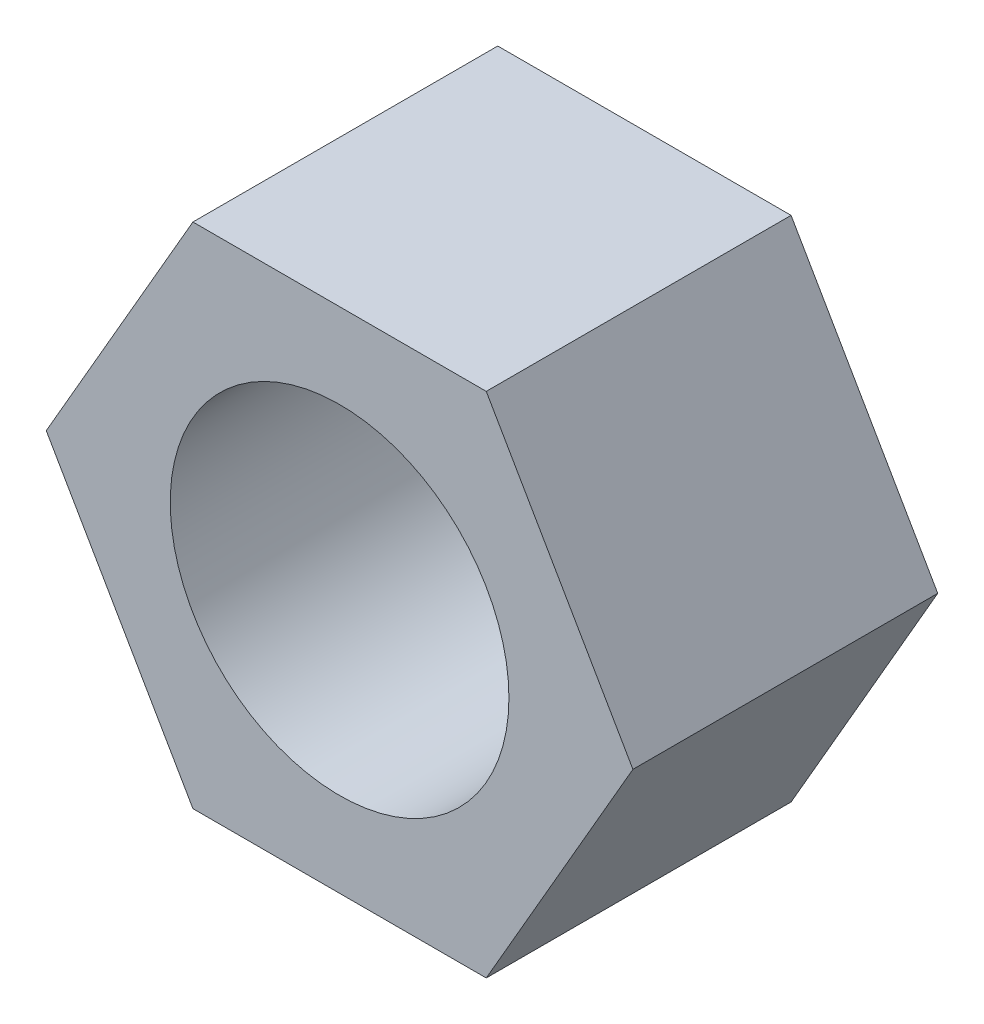
ISO-10303-21;
HEADER;
FILE_DESCRIPTION(('STEP AP214'),'2;1');
FILE_NAME('part.step','',(''),(''),'','','');
FILE_SCHEMA(('AUTOMOTIVE_DESIGN { 1 0 10303 214 1 1 1 1 }'));
ENDSEC;
DATA;
#1=APPLICATION_CONTEXT('core data for automotive mechanical design processes');
#2=APPLICATION_PROTOCOL_DEFINITION('international standard','automotive_design',2000,#1);
#3=PRODUCT_CONTEXT('',#1,'mechanical');
#4=PRODUCT('Part','Part','',(#3));
#5=PRODUCT_RELATED_PRODUCT_CATEGORY('part','',(#4));
#6=PRODUCT_DEFINITION_FORMATION('','',#4);
#7=PRODUCT_DEFINITION_CONTEXT('part definition',#1,'design');
#8=PRODUCT_DEFINITION('design','',#6,#7);
#9=PRODUCT_DEFINITION_SHAPE('','',#8);
#10=(LENGTH_UNIT() NAMED_UNIT(*) SI_UNIT(.MILLI.,.METRE.));
#11=(NAMED_UNIT(*) PLANE_ANGLE_UNIT() SI_UNIT($,.RADIAN.));
#12=(NAMED_UNIT(*) SI_UNIT($,.STERADIAN.) SOLID_ANGLE_UNIT());
#13=UNCERTAINTY_MEASURE_WITH_UNIT(LENGTH_MEASURE(1.E-05),#10,'distance_accuracy_value','');
#14=(GEOMETRIC_REPRESENTATION_CONTEXT(3) GLOBAL_UNCERTAINTY_ASSIGNED_CONTEXT((#13)) GLOBAL_UNIT_ASSIGNED_CONTEXT((#10,
#11,#12)) REPRESENTATION_CONTEXT('',''));
#15=CARTESIAN_POINT('',(0.,0.,0.));
#16=DIRECTION('',(0.,0.,1.));
#17=DIRECTION('',(1.,0.,0.));
#18=AXIS2_PLACEMENT_3D('',#15,#16,#17);
#19=CARTESIAN_POINT('',(-100.,100.,12.5));
#20=DIRECTION('',(0.,0.,-1.));
#21=DIRECTION('',(1.,0.,0.));
#22=AXIS2_PLACEMENT_3D('',#19,#20,#21);
#23=CYLINDRICAL_SURFACE('',#22,6.);
#24=DIRECTION('',(0.,0.,1.));
#25=VECTOR('',#24,1.);
#26=CARTESIAN_POINT('',(-94.,100.,12.5));
#27=LINE('',#26,#25);
#28=CARTESIAN_POINT('',(-94.,100.,12.5));
#29=VERTEX_POINT('',#28);
#30=CARTESIAN_POINT('',(-94.,100.,23.3));
#31=VERTEX_POINT('',#30);
#32=EDGE_CURVE('E11',#29,#31,#27,.T.);
#33=ORIENTED_EDGE('',*,*,#32,.T.);
#34=CARTESIAN_POINT('',(-100.,100.,23.3));
#35=DIRECTION('',(0.,0.,1.));
#36=DIRECTION('',(1.,0.,0.));
#37=AXIS2_PLACEMENT_3D('',#34,#35,#36);
#38=CIRCLE('',#37,6.);
#39=EDGE_CURVE('E127',#31,#31,#38,.T.);
#40=ORIENTED_EDGE('',*,*,#39,.T.);
#41=ORIENTED_EDGE('',*,*,#32,.F.);
#42=CARTESIAN_POINT('',(-100.,100.,12.5));
#43=DIRECTION('',(0.,0.,1.));
#44=DIRECTION('',(1.,0.,0.));
#45=AXIS2_PLACEMENT_3D('',#42,#43,#44);
#46=CIRCLE('',#45,6.);
#47=EDGE_CURVE('E116',#29,#29,#46,.T.);
#48=ORIENTED_EDGE('',*,*,#47,.F.);
#49=EDGE_LOOP('',(#33,#40,#41,#48));
#50=FACE_BOUND('',#49,.T.);
#51=ADVANCED_FACE('F17',(#50),#23,.F.);
#52=CARTESIAN_POINT('',(-110.3923048454,100.,12.5));
#53=DIRECTION('',(0.866025403784329,0.50000000000019,0.));
#54=DIRECTION('',(0.,0.,-1.));
#55=AXIS2_PLACEMENT_3D('',#52,#53,#54);
#56=PLANE('',#55);
#57=DIRECTION('',(0.50000000000019,-0.866025403784329,0.));
#58=VECTOR('',#57,1.);
#59=CARTESIAN_POINT('',(-110.3923048454,100.,12.5));
#60=LINE('',#59,#58);
#61=CARTESIAN_POINT('',(-110.3923048454,100.,12.5));
#62=VERTEX_POINT('',#61);
#63=CARTESIAN_POINT('',(-105.1961524227,91.,12.5));
#64=VERTEX_POINT('',#63);
#65=EDGE_CURVE('E149',#62,#64,#60,.T.);
#66=ORIENTED_EDGE('',*,*,#65,.T.);
#67=DIRECTION('',(0.,0.,1.));
#68=VECTOR('',#67,1.);
#69=CARTESIAN_POINT('',(-105.1961524227,91.,12.5));
#70=LINE('',#69,#68);
#71=CARTESIAN_POINT('',(-105.1961524227,91.,23.3));
#72=VERTEX_POINT('',#71);
#73=EDGE_CURVE('E101',#64,#72,#70,.T.);
#74=ORIENTED_EDGE('',*,*,#73,.T.);
#75=DIRECTION('',(0.50000000000019,-0.866025403784329,0.));
#76=VECTOR('',#75,1.);
#77=CARTESIAN_POINT('',(-110.3923048454,100.,23.3));
#78=LINE('',#77,#76);
#79=CARTESIAN_POINT('',(-110.3923048454,100.,23.3));
#80=VERTEX_POINT('',#79);
#81=EDGE_CURVE('E104',#80,#72,#78,.T.);
#82=ORIENTED_EDGE('',*,*,#81,.F.);
#83=DIRECTION('',(0.,0.,1.));
#84=VECTOR('',#83,1.);
#85=CARTESIAN_POINT('',(-110.3923048454,100.,12.5));
#86=LINE('',#85,#84);
#87=EDGE_CURVE('E27',#62,#80,#86,.T.);
#88=ORIENTED_EDGE('',*,*,#87,.F.);
#89=EDGE_LOOP('',(#66,#74,#82,#88));
#90=FACE_BOUND('',#89,.T.);
#91=ADVANCED_FACE('F105',(#90),#56,.F.);
#92=CARTESIAN_POINT('',(-105.1961524227,109.,12.5));
#93=DIRECTION('',(0.866025403784329,-0.50000000000019,0.));
#94=DIRECTION('',(0.,0.,-1.));
#95=AXIS2_PLACEMENT_3D('',#92,#93,#94);
#96=PLANE('',#95);
#97=DIRECTION('',(-0.50000000000019,-0.866025403784329,0.));
#98=VECTOR('',#97,1.);
#99=CARTESIAN_POINT('',(-105.1961524227,109.,12.5));
#100=LINE('',#99,#98);
#101=CARTESIAN_POINT('',(-105.1961524227,109.,12.5));
#102=VERTEX_POINT('',#101);
#103=EDGE_CURVE('E96',#102,#62,#100,.T.);
#104=ORIENTED_EDGE('',*,*,#103,.T.);
#105=ORIENTED_EDGE('',*,*,#87,.T.);
#106=DIRECTION('',(-0.50000000000019,-0.866025403784329,0.));
#107=VECTOR('',#106,1.);
#108=CARTESIAN_POINT('',(-105.1961524227,109.,23.3));
#109=LINE('',#108,#107);
#110=CARTESIAN_POINT('',(-105.1961524227,109.,23.3));
#111=VERTEX_POINT('',#110);
#112=EDGE_CURVE('E94',#111,#80,#109,.T.);
#113=ORIENTED_EDGE('',*,*,#112,.F.);
#114=DIRECTION('',(0.,0.,1.));
#115=VECTOR('',#114,1.);
#116=CARTESIAN_POINT('',(-105.1961524227,109.,12.5));
#117=LINE('',#116,#115);
#118=EDGE_CURVE('E166',#102,#111,#117,.T.);
#119=ORIENTED_EDGE('',*,*,#118,.F.);
#120=EDGE_LOOP('',(#104,#105,#113,#119));
#121=FACE_BOUND('',#120,.T.);
#122=ADVANCED_FACE('F19',(#121),#96,.F.);
#123=CARTESIAN_POINT('',(-105.1961524227,91.,12.5));
#124=DIRECTION('',(0.,1.,0.));
#125=DIRECTION('',(1.,0.,0.));
#126=AXIS2_PLACEMENT_3D('',#123,#124,#125);
#127=PLANE('',#126);
#128=DIRECTION('',(1.,0.,0.));
#129=VECTOR('',#128,1.);
#130=CARTESIAN_POINT('',(-105.1961524227,91.,12.5));
#131=LINE('',#130,#129);
#132=CARTESIAN_POINT('',(-94.80384757729,91.,12.5));
#133=VERTEX_POINT('',#132);
#134=EDGE_CURVE('E154',#64,#133,#131,.T.);
#135=ORIENTED_EDGE('',*,*,#134,.T.);
#136=DIRECTION('',(0.,0.,1.));
#137=VECTOR('',#136,1.);
#138=CARTESIAN_POINT('',(-94.80384757729,91.,12.5));
#139=LINE('',#138,#137);
#140=CARTESIAN_POINT('',(-94.80384757729,91.,23.3));
#141=VERTEX_POINT('',#140);
#142=EDGE_CURVE('E174',#133,#141,#139,.T.);
#143=ORIENTED_EDGE('',*,*,#142,.T.);
#144=DIRECTION('',(1.,0.,0.));
#145=VECTOR('',#144,1.);
#146=CARTESIAN_POINT('',(-105.1961524227,91.,23.3));
#147=LINE('',#146,#145);
#148=EDGE_CURVE('E109',#72,#141,#147,.T.);
#149=ORIENTED_EDGE('',*,*,#148,.F.);
#150=ORIENTED_EDGE('',*,*,#73,.F.);
#151=EDGE_LOOP('',(#135,#143,#149,#150));
#152=FACE_BOUND('',#151,.T.);
#153=ADVANCED_FACE('F250',(#152),#127,.F.);
#154=CARTESIAN_POINT('',(-100.,100.,23.3));
#155=DIRECTION('',(0.,0.,1.));
#156=DIRECTION('',(1.,0.,0.));
#157=AXIS2_PLACEMENT_3D('',#154,#155,#156);
#158=PLANE('',#157);
#159=ORIENTED_EDGE('',*,*,#39,.F.);
#160=EDGE_LOOP('',(#159));
#161=FACE_BOUND('',#160,.T.);
#162=DIRECTION('',(-0.50000000000019,0.866025403784329,0.));
#163=VECTOR('',#162,1.);
#164=CARTESIAN_POINT('',(-89.60769515458,100.,23.3));
#165=LINE('',#164,#163);
#166=CARTESIAN_POINT('',(-89.60769515458,100.,23.3));
#167=VERTEX_POINT('',#166);
#168=CARTESIAN_POINT('',(-94.80384757729,109.,23.3));
#169=VERTEX_POINT('',#168);
#170=EDGE_CURVE('E197',#167,#169,#165,.T.);
#171=ORIENTED_EDGE('',*,*,#170,.T.);
#172=DIRECTION('',(-1.,0.,0.));
#173=VECTOR('',#172,1.);
#174=CARTESIAN_POINT('',(-94.80384757729,109.,23.3));
#175=LINE('',#174,#173);
#176=EDGE_CURVE('E113',#169,#111,#175,.T.);
#177=ORIENTED_EDGE('',*,*,#176,.T.);
#178=ORIENTED_EDGE('',*,*,#112,.T.);
#179=ORIENTED_EDGE('',*,*,#81,.T.);
#180=ORIENTED_EDGE('',*,*,#148,.T.);
#181=DIRECTION('',(0.50000000000019,0.866025403784329,0.));
#182=VECTOR('',#181,1.);
#183=CARTESIAN_POINT('',(-94.80384757729,91.,23.3));
#184=LINE('',#183,#182);
#185=EDGE_CURVE('E179',#141,#167,#184,.T.);
#186=ORIENTED_EDGE('',*,*,#185,.T.);
#187=EDGE_LOOP('',(#171,#177,#178,#179,#180,#186));
#188=FACE_BOUND('',#187,.T.);
#189=ADVANCED_FACE('F112',(#161,#188),#158,.T.);
#190=CARTESIAN_POINT('',(-100.,100.,12.5));
#191=DIRECTION('',(0.,0.,1.));
#192=DIRECTION('',(1.,0.,0.));
#193=AXIS2_PLACEMENT_3D('',#190,#191,#192);
#194=PLANE('',#193);
#195=ORIENTED_EDGE('',*,*,#47,.T.);
#196=EDGE_LOOP('',(#195));
#197=FACE_BOUND('',#196,.T.);
#198=DIRECTION('',(0.50000000000019,0.866025403784329,0.));
#199=VECTOR('',#198,1.);
#200=CARTESIAN_POINT('',(-94.80384757729,91.,12.5));
#201=LINE('',#200,#199);
#202=CARTESIAN_POINT('',(-89.60769515458,100.,12.5));
#203=VERTEX_POINT('',#202);
#204=EDGE_CURVE('E189',#133,#203,#201,.T.);
#205=ORIENTED_EDGE('',*,*,#204,.F.);
#206=ORIENTED_EDGE('',*,*,#134,.F.);
#207=ORIENTED_EDGE('',*,*,#65,.F.);
#208=ORIENTED_EDGE('',*,*,#103,.F.);
#209=DIRECTION('',(-1.,0.,0.));
#210=VECTOR('',#209,1.);
#211=CARTESIAN_POINT('',(-94.80384757729,109.,12.5));
#212=LINE('',#211,#210);
#213=CARTESIAN_POINT('',(-94.80384757729,109.,12.5));
#214=VERTEX_POINT('',#213);
#215=EDGE_CURVE('E170',#214,#102,#212,.T.);
#216=ORIENTED_EDGE('',*,*,#215,.F.);
#217=DIRECTION('',(-0.50000000000019,0.866025403784329,0.));
#218=VECTOR('',#217,1.);
#219=CARTESIAN_POINT('',(-89.60769515458,100.,12.5));
#220=LINE('',#219,#218);
#221=EDGE_CURVE('E212',#203,#214,#220,.T.);
#222=ORIENTED_EDGE('',*,*,#221,.F.);
#223=EDGE_LOOP('',(#205,#206,#207,#208,#216,#222));
#224=FACE_BOUND('',#223,.T.);
#225=ADVANCED_FACE('F241',(#197,#224),#194,.F.);
#226=CARTESIAN_POINT('',(-94.80384757729,109.,12.5));
#227=DIRECTION('',(0.,-1.,0.));
#228=DIRECTION('',(0.,0.,-1.));
#229=AXIS2_PLACEMENT_3D('',#226,#227,#228);
#230=PLANE('',#229);
#231=ORIENTED_EDGE('',*,*,#215,.T.);
#232=ORIENTED_EDGE('',*,*,#118,.T.);
#233=ORIENTED_EDGE('',*,*,#176,.F.);
#234=DIRECTION('',(0.,0.,1.));
#235=VECTOR('',#234,1.);
#236=CARTESIAN_POINT('',(-94.80384757729,109.,12.5));
#237=LINE('',#236,#235);
#238=EDGE_CURVE('E205',#214,#169,#237,.T.);
#239=ORIENTED_EDGE('',*,*,#238,.F.);
#240=EDGE_LOOP('',(#231,#232,#233,#239));
#241=FACE_BOUND('',#240,.T.);
#242=ADVANCED_FACE('F244',(#241),#230,.F.);
#243=CARTESIAN_POINT('',(-94.80384757729,91.,12.5));
#244=DIRECTION('',(-0.866025403784329,0.50000000000019,0.));
#245=DIRECTION('',(0.,0.,1.));
#246=AXIS2_PLACEMENT_3D('',#243,#244,#245);
#247=PLANE('',#246);
#248=ORIENTED_EDGE('',*,*,#204,.T.);
#249=DIRECTION('',(0.,0.,1.));
#250=VECTOR('',#249,1.);
#251=CARTESIAN_POINT('',(-89.60769515458,100.,12.5));
#252=LINE('',#251,#250);
#253=EDGE_CURVE('E193',#203,#167,#252,.T.);
#254=ORIENTED_EDGE('',*,*,#253,.T.);
#255=ORIENTED_EDGE('',*,*,#185,.F.);
#256=ORIENTED_EDGE('',*,*,#142,.F.);
#257=EDGE_LOOP('',(#248,#254,#255,#256));
#258=FACE_BOUND('',#257,.T.);
#259=ADVANCED_FACE('F248',(#258),#247,.F.);
#260=CARTESIAN_POINT('',(-89.60769515458,100.,12.5));
#261=DIRECTION('',(-0.866025403784329,-0.50000000000019,0.));
#262=DIRECTION('',(-0.50000000000019,0.866025403784329,0.));
#263=AXIS2_PLACEMENT_3D('',#260,#261,#262);
#264=PLANE('',#263);
#265=ORIENTED_EDGE('',*,*,#221,.T.);
#266=ORIENTED_EDGE('',*,*,#238,.T.);
#267=ORIENTED_EDGE('',*,*,#170,.F.);
#268=ORIENTED_EDGE('',*,*,#253,.F.);
#269=EDGE_LOOP('',(#265,#266,#267,#268));
#270=FACE_BOUND('',#269,.T.);
#271=ADVANCED_FACE('F236',(#270),#264,.F.);
#272=CLOSED_SHELL('',(#51,#91,#122,#153,#189,#225,#242,#259,#271));
#273=MANIFOLD_SOLID_BREP('B1',#272);
#274=ADVANCED_BREP_SHAPE_REPRESENTATION('',(#18,#273),#14);
#275=SHAPE_DEFINITION_REPRESENTATION(#9,#274);
ENDSEC;
END-ISO-10303-21;
